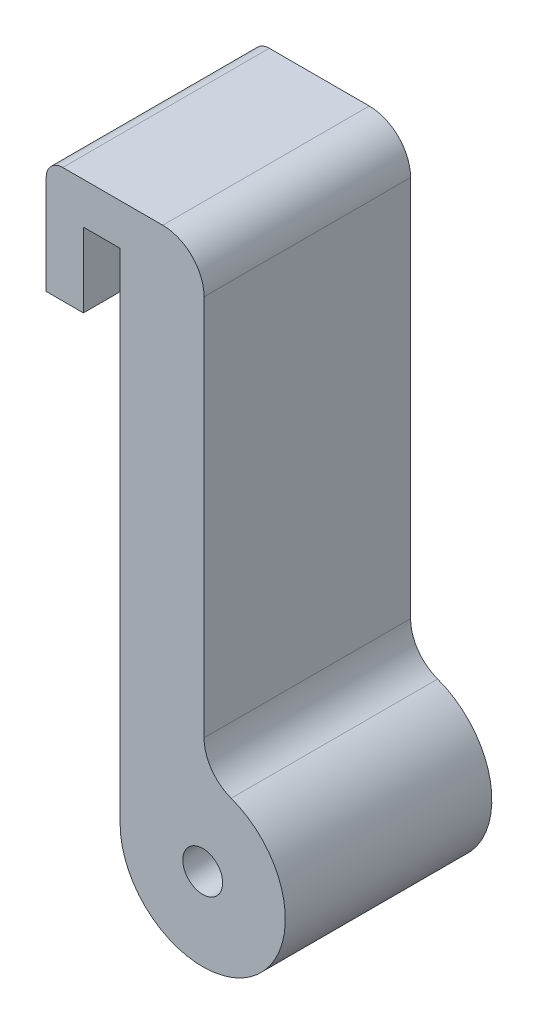
ISO-10303-21;
HEADER;
FILE_DESCRIPTION(('STEP AP214'),'2;1');
FILE_NAME('part.step','',(''),(''),'','','');
FILE_SCHEMA(('AUTOMOTIVE_DESIGN { 1 0 10303 214 1 1 1 1 }'));
ENDSEC;
DATA;
#1=APPLICATION_CONTEXT('core data for automotive mechanical design processes');
#2=APPLICATION_PROTOCOL_DEFINITION('international standard','automotive_design',2000,#1);
#3=PRODUCT_CONTEXT('',#1,'mechanical');
#4=PRODUCT('Part','Part','',(#3));
#5=PRODUCT_RELATED_PRODUCT_CATEGORY('part','',(#4));
#6=PRODUCT_DEFINITION_FORMATION('','',#4);
#7=PRODUCT_DEFINITION_CONTEXT('part definition',#1,'design');
#8=PRODUCT_DEFINITION('design','',#6,#7);
#9=PRODUCT_DEFINITION_SHAPE('','',#8);
#10=(LENGTH_UNIT() NAMED_UNIT(*) SI_UNIT(.MILLI.,.METRE.));
#11=(NAMED_UNIT(*) PLANE_ANGLE_UNIT() SI_UNIT($,.RADIAN.));
#12=(NAMED_UNIT(*) SI_UNIT($,.STERADIAN.) SOLID_ANGLE_UNIT());
#13=UNCERTAINTY_MEASURE_WITH_UNIT(LENGTH_MEASURE(1.E-05),#10,'distance_accuracy_value','');
#14=(GEOMETRIC_REPRESENTATION_CONTEXT(3) GLOBAL_UNCERTAINTY_ASSIGNED_CONTEXT((#13)) GLOBAL_UNIT_ASSIGNED_CONTEXT((#10,
#11,#12)) REPRESENTATION_CONTEXT('',''));
#15=CARTESIAN_POINT('',(0.,0.,0.));
#16=DIRECTION('',(0.,0.,1.));
#17=DIRECTION('',(1.,0.,0.));
#18=AXIS2_PLACEMENT_3D('',#15,#16,#17);
#19=CARTESIAN_POINT('',(-9.68000000000001,120.65,50.));
#20=DIRECTION('',(0.,0.,-1.));
#21=DIRECTION('',(-1.,0.,0.));
#22=AXIS2_PLACEMENT_3D('',#19,#20,#21);
#23=PLANE('',#22);
#24=CARTESIAN_POINT('',(-9.68000000000001,120.65,50.));
#25=DIRECTION('',(0.,0.,1.));
#26=DIRECTION('',(-1.,0.,0.));
#27=AXIS2_PLACEMENT_3D('',#24,#25,#26);
#28=CIRCLE('',#27,10.);
#29=CARTESIAN_POINT('',(0.319999999999994,120.65,50.));
#30=VERTEX_POINT('',#29);
#31=CARTESIAN_POINT('',(-9.68000000000008,130.65,50.));
#32=VERTEX_POINT('',#31);
#33=EDGE_CURVE('E169',#30,#32,#28,.T.);
#34=ORIENTED_EDGE('',*,*,#33,.T.);
#35=DIRECTION('',(-1.,0.,0.));
#36=VECTOR('',#35,1.);
#37=CARTESIAN_POINT('',(-33.89,130.65,50.));
#38=LINE('',#37,#36);
#39=CARTESIAN_POINT('',(-33.89,130.65,50.));
#40=VERTEX_POINT('',#39);
#41=EDGE_CURVE('E102',#32,#40,#38,.T.);
#42=ORIENTED_EDGE('',*,*,#41,.T.);
#43=CARTESIAN_POINT('',(-33.89,126.65,50.));
#44=DIRECTION('',(0.,0.,1.));
#45=DIRECTION('',(-1.,0.,0.));
#46=AXIS2_PLACEMENT_3D('',#43,#44,#45);
#47=CIRCLE('',#46,4.);
#48=CARTESIAN_POINT('',(-37.89,126.65,50.));
#49=VERTEX_POINT('',#48);
#50=EDGE_CURVE('E193',#40,#49,#47,.T.);
#51=ORIENTED_EDGE('',*,*,#50,.T.);
#52=DIRECTION('',(0.,-1.,0.));
#53=VECTOR('',#52,1.);
#54=CARTESIAN_POINT('',(-37.89,102.65,50.));
#55=LINE('',#54,#53);
#56=CARTESIAN_POINT('',(-37.89,102.65,50.));
#57=VERTEX_POINT('',#56);
#58=EDGE_CURVE('E212',#49,#57,#55,.T.);
#59=ORIENTED_EDGE('',*,*,#58,.T.);
#60=DIRECTION('',(1.,0.,0.));
#61=VECTOR('',#60,1.);
#62=CARTESIAN_POINT('',(-28.89,102.65,50.));
#63=LINE('',#62,#61);
#64=CARTESIAN_POINT('',(-28.89,102.65,50.));
#65=VERTEX_POINT('',#64);
#66=EDGE_CURVE('E209',#57,#65,#63,.T.);
#67=ORIENTED_EDGE('',*,*,#66,.T.);
#68=DIRECTION('',(0.,1.,0.));
#69=VECTOR('',#68,1.);
#70=CARTESIAN_POINT('',(-28.89,120.65,50.));
#71=LINE('',#70,#69);
#72=CARTESIAN_POINT('',(-28.89,120.65,50.));
#73=VERTEX_POINT('',#72);
#74=EDGE_CURVE('E211',#65,#73,#71,.T.);
#75=ORIENTED_EDGE('',*,*,#74,.T.);
#76=DIRECTION('',(1.,0.,0.));
#77=VECTOR('',#76,1.);
#78=CARTESIAN_POINT('',(-20.,120.65,50.));
#79=LINE('',#78,#77);
#80=CARTESIAN_POINT('',(-20.,120.65,50.));
#81=VERTEX_POINT('',#80);
#82=EDGE_CURVE('E214',#73,#81,#79,.T.);
#83=ORIENTED_EDGE('',*,*,#82,.T.);
#84=DIRECTION('',(0.,-1.,0.));
#85=VECTOR('',#84,1.);
#86=CARTESIAN_POINT('',(-20.,120.65,50.));
#87=LINE('',#86,#85);
#88=CARTESIAN_POINT('',(-20.,0.,50.));
#89=VERTEX_POINT('',#88);
#90=EDGE_CURVE('E130',#81,#89,#87,.T.);
#91=ORIENTED_EDGE('',*,*,#90,.T.);
#92=CARTESIAN_POINT('',(0.,0.,50.));
#93=DIRECTION('',(0.,0.,1.));
#94=DIRECTION('',(-1.,0.,0.));
#95=AXIS2_PLACEMENT_3D('',#92,#93,#94);
#96=CIRCLE('',#95,20.);
#97=CARTESIAN_POINT('',(6.88,18.7793929614352,50.));
#98=VERTEX_POINT('',#97);
#99=EDGE_CURVE('E124',#89,#98,#96,.T.);
#100=ORIENTED_EDGE('',*,*,#99,.T.);
#101=CARTESIAN_POINT('',(10.32,28.1690894421527,50.));
#102=DIRECTION('',(0.,0.,-1.));
#103=DIRECTION('',(1.,0.,0.));
#104=AXIS2_PLACEMENT_3D('',#101,#102,#103);
#105=CIRCLE('',#104,10.);
#106=CARTESIAN_POINT('',(0.319999999999997,28.1690894421527,50.));
#107=VERTEX_POINT('',#106);
#108=EDGE_CURVE('E128',#98,#107,#105,.T.);
#109=ORIENTED_EDGE('',*,*,#108,.T.);
#110=DIRECTION('',(0.,1.,0.));
#111=VECTOR('',#110,1.);
#112=CARTESIAN_POINT('',(0.319999999999996,28.1690894421527,50.));
#113=LINE('',#112,#111);
#114=EDGE_CURVE('E50',#107,#30,#113,.T.);
#115=ORIENTED_EDGE('',*,*,#114,.T.);
#116=EDGE_LOOP('',(#34,#42,#51,#59,#67,#75,#83,#91,#100,#109,#115));
#117=FACE_BOUND('',#116,.T.);
#118=CARTESIAN_POINT('',(0.,0.,50.));
#119=DIRECTION('',(0.,0.,1.));
#120=DIRECTION('',(1.,0.,0.));
#121=AXIS2_PLACEMENT_3D('',#118,#119,#120);
#122=CIRCLE('',#121,4.826);
#123=CARTESIAN_POINT('',(4.826,0.,50.));
#124=VERTEX_POINT('',#123);
#125=EDGE_CURVE('E152',#124,#124,#122,.T.);
#126=ORIENTED_EDGE('',*,*,#125,.F.);
#127=EDGE_LOOP('',(#126));
#128=FACE_BOUND('',#127,.T.);
#129=ADVANCED_FACE('F33',(#117,#128),#23,.F.);
#130=CARTESIAN_POINT('',(-9.68000000000001,120.65,0.));
#131=DIRECTION('',(0.,0.,-1.));
#132=DIRECTION('',(-1.,0.,0.));
#133=AXIS2_PLACEMENT_3D('',#130,#131,#132);
#134=PLANE('',#133);
#135=CARTESIAN_POINT('',(-9.68000000000001,120.65,0.));
#136=DIRECTION('',(0.,0.,1.));
#137=DIRECTION('',(-1.,0.,0.));
#138=AXIS2_PLACEMENT_3D('',#135,#136,#137);
#139=CIRCLE('',#138,10.);
#140=CARTESIAN_POINT('',(0.319999999999994,120.65,0.));
#141=VERTEX_POINT('',#140);
#142=CARTESIAN_POINT('',(-9.68000000000008,130.65,0.));
#143=VERTEX_POINT('',#142);
#144=EDGE_CURVE('E148',#141,#143,#139,.T.);
#145=ORIENTED_EDGE('',*,*,#144,.F.);
#146=DIRECTION('',(0.,1.,0.));
#147=VECTOR('',#146,1.);
#148=CARTESIAN_POINT('',(0.319999999999996,28.1690894421527,0.));
#149=LINE('',#148,#147);
#150=CARTESIAN_POINT('',(0.319999999999997,28.1690894421527,0.));
#151=VERTEX_POINT('',#150);
#152=EDGE_CURVE('E94',#151,#141,#149,.T.);
#153=ORIENTED_EDGE('',*,*,#152,.F.);
#154=CARTESIAN_POINT('',(10.32,28.1690894421527,0.));
#155=DIRECTION('',(0.,0.,-1.));
#156=DIRECTION('',(1.,0.,0.));
#157=AXIS2_PLACEMENT_3D('',#154,#155,#156);
#158=CIRCLE('',#157,10.);
#159=CARTESIAN_POINT('',(6.88,18.7793929614352,0.));
#160=VERTEX_POINT('',#159);
#161=EDGE_CURVE('E88',#160,#151,#158,.T.);
#162=ORIENTED_EDGE('',*,*,#161,.F.);
#163=CARTESIAN_POINT('',(0.,0.,0.));
#164=DIRECTION('',(0.,0.,1.));
#165=DIRECTION('',(-1.,0.,0.));
#166=AXIS2_PLACEMENT_3D('',#163,#164,#165);
#167=CIRCLE('',#166,20.);
#168=CARTESIAN_POINT('',(-20.,0.,0.));
#169=VERTEX_POINT('',#168);
#170=EDGE_CURVE('E138',#169,#160,#167,.T.);
#171=ORIENTED_EDGE('',*,*,#170,.F.);
#172=DIRECTION('',(0.,-1.,0.));
#173=VECTOR('',#172,1.);
#174=CARTESIAN_POINT('',(-20.,120.65,0.));
#175=LINE('',#174,#173);
#176=CARTESIAN_POINT('',(-20.,120.65,0.));
#177=VERTEX_POINT('',#176);
#178=EDGE_CURVE('E164',#177,#169,#175,.T.);
#179=ORIENTED_EDGE('',*,*,#178,.F.);
#180=DIRECTION('',(1.,0.,0.));
#181=VECTOR('',#180,1.);
#182=CARTESIAN_POINT('',(-20.,120.65,0.));
#183=LINE('',#182,#181);
#184=CARTESIAN_POINT('',(-28.89,120.65,0.));
#185=VERTEX_POINT('',#184);
#186=EDGE_CURVE('E162',#185,#177,#183,.T.);
#187=ORIENTED_EDGE('',*,*,#186,.F.);
#188=DIRECTION('',(0.,1.,0.));
#189=VECTOR('',#188,1.);
#190=CARTESIAN_POINT('',(-28.89,120.65,0.));
#191=LINE('',#190,#189);
#192=CARTESIAN_POINT('',(-28.89,102.65,0.));
#193=VERTEX_POINT('',#192);
#194=EDGE_CURVE('E160',#193,#185,#191,.T.);
#195=ORIENTED_EDGE('',*,*,#194,.F.);
#196=DIRECTION('',(1.,0.,0.));
#197=VECTOR('',#196,1.);
#198=CARTESIAN_POINT('',(-28.89,102.65,0.));
#199=LINE('',#198,#197);
#200=CARTESIAN_POINT('',(-37.89,102.65,0.));
#201=VERTEX_POINT('',#200);
#202=EDGE_CURVE('E158',#201,#193,#199,.T.);
#203=ORIENTED_EDGE('',*,*,#202,.F.);
#204=DIRECTION('',(0.,-1.,0.));
#205=VECTOR('',#204,1.);
#206=CARTESIAN_POINT('',(-37.89,102.65,0.));
#207=LINE('',#206,#205);
#208=CARTESIAN_POINT('',(-37.89,126.65,0.));
#209=VERTEX_POINT('',#208);
#210=EDGE_CURVE('E156',#209,#201,#207,.T.);
#211=ORIENTED_EDGE('',*,*,#210,.F.);
#212=CARTESIAN_POINT('',(-33.89,126.65,0.));
#213=DIRECTION('',(0.,0.,1.));
#214=DIRECTION('',(-1.,0.,0.));
#215=AXIS2_PLACEMENT_3D('',#212,#213,#214);
#216=CIRCLE('',#215,4.);
#217=CARTESIAN_POINT('',(-33.89,130.65,0.));
#218=VERTEX_POINT('',#217);
#219=EDGE_CURVE('E154',#218,#209,#216,.T.);
#220=ORIENTED_EDGE('',*,*,#219,.F.);
#221=DIRECTION('',(-1.,0.,0.));
#222=VECTOR('',#221,1.);
#223=CARTESIAN_POINT('',(-33.89,130.65,0.));
#224=LINE('',#223,#222);
#225=EDGE_CURVE('E151',#143,#218,#224,.T.);
#226=ORIENTED_EDGE('',*,*,#225,.F.);
#227=EDGE_LOOP('',(#145,#153,#162,#171,#179,#187,#195,#203,#211,#220,#226));
#228=FACE_BOUND('',#227,.T.);
#229=CARTESIAN_POINT('',(0.,0.,0.));
#230=DIRECTION('',(0.,0.,1.));
#231=DIRECTION('',(1.,0.,0.));
#232=AXIS2_PLACEMENT_3D('',#229,#230,#231);
#233=CIRCLE('',#232,4.826);
#234=CARTESIAN_POINT('',(4.826,0.,0.));
#235=VERTEX_POINT('',#234);
#236=EDGE_CURVE('E352',#235,#235,#233,.T.);
#237=ORIENTED_EDGE('',*,*,#236,.T.);
#238=EDGE_LOOP('',(#237));
#239=FACE_BOUND('',#238,.T.);
#240=ADVANCED_FACE('F197',(#228,#239),#134,.T.);
#241=CARTESIAN_POINT('',(-9.68000000000001,120.65,50.));
#242=DIRECTION('',(0.,0.,-1.));
#243=DIRECTION('',(-1.,0.,0.));
#244=AXIS2_PLACEMENT_3D('',#241,#242,#243);
#245=CYLINDRICAL_SURFACE('',#244,10.);
#246=ORIENTED_EDGE('',*,*,#144,.T.);
#247=DIRECTION('',(0.,0.,-1.));
#248=VECTOR('',#247,1.);
#249=CARTESIAN_POINT('',(-9.68000000000008,130.65,50.));
#250=LINE('',#249,#248);
#251=EDGE_CURVE('E11',#32,#143,#250,.T.);
#252=ORIENTED_EDGE('',*,*,#251,.F.);
#253=ORIENTED_EDGE('',*,*,#33,.F.);
#254=DIRECTION('',(0.,0.,-1.));
#255=VECTOR('',#254,1.);
#256=CARTESIAN_POINT('',(0.319999999999994,120.65,50.));
#257=LINE('',#256,#255);
#258=EDGE_CURVE('E144',#30,#141,#257,.T.);
#259=ORIENTED_EDGE('',*,*,#258,.T.);
#260=EDGE_LOOP('',(#246,#252,#253,#259));
#261=FACE_BOUND('',#260,.T.);
#262=ADVANCED_FACE('F35',(#261),#245,.T.);
#263=CARTESIAN_POINT('',(-33.89,130.65,50.));
#264=DIRECTION('',(0.,-1.,0.));
#265=DIRECTION('',(0.,0.,-1.));
#266=AXIS2_PLACEMENT_3D('',#263,#264,#265);
#267=PLANE('',#266);
#268=ORIENTED_EDGE('',*,*,#225,.T.);
#269=DIRECTION('',(0.,0.,-1.));
#270=VECTOR('',#269,1.);
#271=CARTESIAN_POINT('',(-33.89,130.65,50.));
#272=LINE('',#271,#270);
#273=EDGE_CURVE('E42',#40,#218,#272,.T.);
#274=ORIENTED_EDGE('',*,*,#273,.F.);
#275=ORIENTED_EDGE('',*,*,#41,.F.);
#276=ORIENTED_EDGE('',*,*,#251,.T.);
#277=EDGE_LOOP('',(#268,#274,#275,#276));
#278=FACE_BOUND('',#277,.T.);
#279=ADVANCED_FACE('F251',(#278),#267,.F.);
#280=CARTESIAN_POINT('',(-33.89,126.65,50.));
#281=DIRECTION('',(0.,0.,-1.));
#282=DIRECTION('',(-1.,0.,0.));
#283=AXIS2_PLACEMENT_3D('',#280,#281,#282);
#284=CYLINDRICAL_SURFACE('',#283,4.);
#285=ORIENTED_EDGE('',*,*,#219,.T.);
#286=DIRECTION('',(0.,0.,-1.));
#287=VECTOR('',#286,1.);
#288=CARTESIAN_POINT('',(-37.89,126.65,50.));
#289=LINE('',#288,#287);
#290=EDGE_CURVE('E185',#49,#209,#289,.T.);
#291=ORIENTED_EDGE('',*,*,#290,.F.);
#292=ORIENTED_EDGE('',*,*,#50,.F.);
#293=ORIENTED_EDGE('',*,*,#273,.T.);
#294=EDGE_LOOP('',(#285,#291,#292,#293));
#295=FACE_BOUND('',#294,.T.);
#296=ADVANCED_FACE('F191',(#295),#284,.T.);
#297=CARTESIAN_POINT('',(-37.89,102.65,50.));
#298=DIRECTION('',(1.,0.,0.));
#299=DIRECTION('',(0.,0.,-1.));
#300=AXIS2_PLACEMENT_3D('',#297,#298,#299);
#301=PLANE('',#300);
#302=ORIENTED_EDGE('',*,*,#210,.T.);
#303=DIRECTION('',(0.,0.,-1.));
#304=VECTOR('',#303,1.);
#305=CARTESIAN_POINT('',(-37.89,102.65,50.));
#306=LINE('',#305,#304);
#307=EDGE_CURVE('E182',#57,#201,#306,.T.);
#308=ORIENTED_EDGE('',*,*,#307,.F.);
#309=ORIENTED_EDGE('',*,*,#58,.F.);
#310=ORIENTED_EDGE('',*,*,#290,.T.);
#311=EDGE_LOOP('',(#302,#308,#309,#310));
#312=FACE_BOUND('',#311,.T.);
#313=ADVANCED_FACE('F203',(#312),#301,.F.);
#314=CARTESIAN_POINT('',(-28.89,102.65,50.));
#315=DIRECTION('',(0.,1.,0.));
#316=DIRECTION('',(-1.,0.,0.));
#317=AXIS2_PLACEMENT_3D('',#314,#315,#316);
#318=PLANE('',#317);
#319=ORIENTED_EDGE('',*,*,#202,.T.);
#320=DIRECTION('',(0.,0.,-1.));
#321=VECTOR('',#320,1.);
#322=CARTESIAN_POINT('',(-28.89,102.65,50.));
#323=LINE('',#322,#321);
#324=EDGE_CURVE('E179',#65,#193,#323,.T.);
#325=ORIENTED_EDGE('',*,*,#324,.F.);
#326=ORIENTED_EDGE('',*,*,#66,.F.);
#327=ORIENTED_EDGE('',*,*,#307,.T.);
#328=EDGE_LOOP('',(#319,#325,#326,#327));
#329=FACE_BOUND('',#328,.T.);
#330=ADVANCED_FACE('F207',(#329),#318,.F.);
#331=CARTESIAN_POINT('',(-28.89,120.65,50.));
#332=DIRECTION('',(-1.,0.,0.));
#333=DIRECTION('',(0.,-1.,0.));
#334=AXIS2_PLACEMENT_3D('',#331,#332,#333);
#335=PLANE('',#334);
#336=ORIENTED_EDGE('',*,*,#194,.T.);
#337=DIRECTION('',(0.,0.,-1.));
#338=VECTOR('',#337,1.);
#339=CARTESIAN_POINT('',(-28.89,120.65,50.));
#340=LINE('',#339,#338);
#341=EDGE_CURVE('E176',#73,#185,#340,.T.);
#342=ORIENTED_EDGE('',*,*,#341,.F.);
#343=ORIENTED_EDGE('',*,*,#74,.F.);
#344=ORIENTED_EDGE('',*,*,#324,.T.);
#345=EDGE_LOOP('',(#336,#342,#343,#344));
#346=FACE_BOUND('',#345,.T.);
#347=ADVANCED_FACE('F264',(#346),#335,.F.);
#348=CARTESIAN_POINT('',(-20.,120.65,50.));
#349=DIRECTION('',(0.,1.,0.));
#350=DIRECTION('',(0.,0.,1.));
#351=AXIS2_PLACEMENT_3D('',#348,#349,#350);
#352=PLANE('',#351);
#353=ORIENTED_EDGE('',*,*,#186,.T.);
#354=DIRECTION('',(0.,0.,-1.));
#355=VECTOR('',#354,1.);
#356=CARTESIAN_POINT('',(-20.,120.65,50.));
#357=LINE('',#356,#355);
#358=EDGE_CURVE('E173',#81,#177,#357,.T.);
#359=ORIENTED_EDGE('',*,*,#358,.F.);
#360=ORIENTED_EDGE('',*,*,#82,.F.);
#361=ORIENTED_EDGE('',*,*,#341,.T.);
#362=EDGE_LOOP('',(#353,#359,#360,#361));
#363=FACE_BOUND('',#362,.T.);
#364=ADVANCED_FACE('F223',(#363),#352,.F.);
#365=CARTESIAN_POINT('',(-20.,120.65,50.));
#366=DIRECTION('',(1.,0.,0.));
#367=DIRECTION('',(0.,1.,0.));
#368=AXIS2_PLACEMENT_3D('',#365,#366,#367);
#369=PLANE('',#368);
#370=ORIENTED_EDGE('',*,*,#178,.T.);
#371=DIRECTION('',(0.,0.,-1.));
#372=VECTOR('',#371,1.);
#373=CARTESIAN_POINT('',(-20.,0.,50.));
#374=LINE('',#373,#372);
#375=EDGE_CURVE('E139',#89,#169,#374,.T.);
#376=ORIENTED_EDGE('',*,*,#375,.F.);
#377=ORIENTED_EDGE('',*,*,#90,.F.);
#378=ORIENTED_EDGE('',*,*,#358,.T.);
#379=EDGE_LOOP('',(#370,#376,#377,#378));
#380=FACE_BOUND('',#379,.T.);
#381=ADVANCED_FACE('F227',(#380),#369,.F.);
#382=CARTESIAN_POINT('',(0.,0.,50.));
#383=DIRECTION('',(0.,0.,-1.));
#384=DIRECTION('',(-1.,0.,0.));
#385=AXIS2_PLACEMENT_3D('',#382,#383,#384);
#386=CYLINDRICAL_SURFACE('',#385,20.);
#387=ORIENTED_EDGE('',*,*,#170,.T.);
#388=DIRECTION('',(0.,0.,-1.));
#389=VECTOR('',#388,1.);
#390=CARTESIAN_POINT('',(6.88,18.7793929614352,50.));
#391=LINE('',#390,#389);
#392=EDGE_CURVE('E135',#98,#160,#391,.T.);
#393=ORIENTED_EDGE('',*,*,#392,.F.);
#394=ORIENTED_EDGE('',*,*,#99,.F.);
#395=ORIENTED_EDGE('',*,*,#375,.T.);
#396=EDGE_LOOP('',(#387,#393,#394,#395));
#397=FACE_BOUND('',#396,.T.);
#398=ADVANCED_FACE('F136',(#397),#386,.T.);
#399=CARTESIAN_POINT('',(10.32,28.1690894421527,50.));
#400=DIRECTION('',(0.,0.,-1.));
#401=DIRECTION('',(-1.,0.,0.));
#402=AXIS2_PLACEMENT_3D('',#399,#400,#401);
#403=CYLINDRICAL_SURFACE('',#402,10.);
#404=ORIENTED_EDGE('',*,*,#161,.T.);
#405=DIRECTION('',(0.,0.,-1.));
#406=VECTOR('',#405,1.);
#407=CARTESIAN_POINT('',(0.319999999999997,28.1690894421527,50.));
#408=LINE('',#407,#406);
#409=EDGE_CURVE('E140',#107,#151,#408,.T.);
#410=ORIENTED_EDGE('',*,*,#409,.F.);
#411=ORIENTED_EDGE('',*,*,#108,.F.);
#412=ORIENTED_EDGE('',*,*,#392,.T.);
#413=EDGE_LOOP('',(#404,#410,#411,#412));
#414=FACE_BOUND('',#413,.T.);
#415=ADVANCED_FACE('F142',(#414),#403,.F.);
#416=CARTESIAN_POINT('',(0.319999999999996,28.1690894421527,50.));
#417=DIRECTION('',(-1.,0.,0.));
#418=DIRECTION('',(0.,-1.,0.));
#419=AXIS2_PLACEMENT_3D('',#416,#417,#418);
#420=PLANE('',#419);
#421=ORIENTED_EDGE('',*,*,#152,.T.);
#422=ORIENTED_EDGE('',*,*,#258,.F.);
#423=ORIENTED_EDGE('',*,*,#114,.F.);
#424=ORIENTED_EDGE('',*,*,#409,.T.);
#425=EDGE_LOOP('',(#421,#422,#423,#424));
#426=FACE_BOUND('',#425,.T.);
#427=ADVANCED_FACE('F231',(#426),#420,.F.);
#428=CARTESIAN_POINT('',(0.,0.,50.));
#429=DIRECTION('',(0.,0.,-1.));
#430=DIRECTION('',(-1.,0.,0.));
#431=AXIS2_PLACEMENT_3D('',#428,#429,#430);
#432=CYLINDRICAL_SURFACE('',#431,4.826);
#433=ORIENTED_EDGE('',*,*,#125,.T.);
#434=EDGE_LOOP('',(#433));
#435=FACE_BOUND('',#434,.T.);
#436=ORIENTED_EDGE('',*,*,#236,.F.);
#437=EDGE_LOOP('',(#436));
#438=FACE_BOUND('',#437,.T.);
#439=ADVANCED_FACE('F233',(#435,#438),#432,.F.);
#440=CLOSED_SHELL('',(#129,#240,#262,#279,#296,#313,#330,#347,#364,#381,#398,#415,#427,#439));
#441=MANIFOLD_SOLID_BREP('B2',#440);
#442=ADVANCED_BREP_SHAPE_REPRESENTATION('',(#18,#441),#14);
#443=SHAPE_DEFINITION_REPRESENTATION(#9,#442);
ENDSEC;
END-ISO-10303-21;
